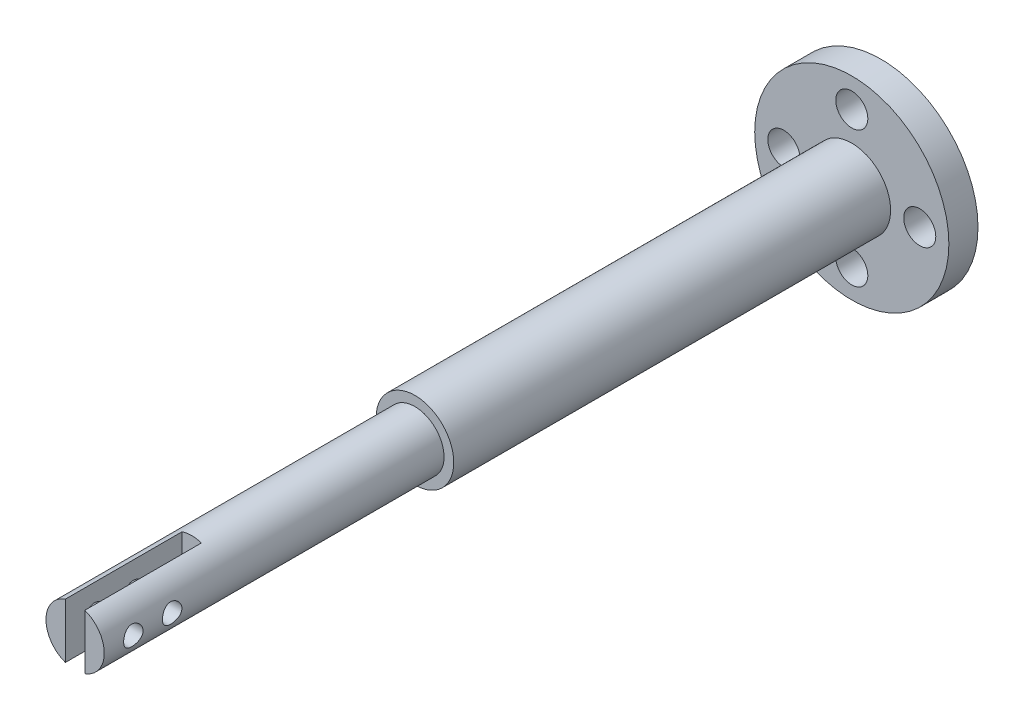
ISO-10303-21;
HEADER;
FILE_DESCRIPTION(('STEP AP214'),'2;1');
FILE_NAME('part.step','',(''),(''),'','','');
FILE_SCHEMA(('AUTOMOTIVE_DESIGN { 1 0 10303 214 1 1 1 1 }'));
ENDSEC;
DATA;
#1=APPLICATION_CONTEXT('core data for automotive mechanical design processes');
#2=APPLICATION_PROTOCOL_DEFINITION('international standard','automotive_design',2000,#1);
#3=PRODUCT_CONTEXT('',#1,'mechanical');
#4=PRODUCT('Part','Part','',(#3));
#5=PRODUCT_RELATED_PRODUCT_CATEGORY('part','',(#4));
#6=PRODUCT_DEFINITION_FORMATION('','',#4);
#7=PRODUCT_DEFINITION_CONTEXT('part definition',#1,'design');
#8=PRODUCT_DEFINITION('design','',#6,#7);
#9=PRODUCT_DEFINITION_SHAPE('','',#8);
#10=(LENGTH_UNIT() NAMED_UNIT(*) SI_UNIT(.MILLI.,.METRE.));
#11=(NAMED_UNIT(*) PLANE_ANGLE_UNIT() SI_UNIT($,.RADIAN.));
#12=(NAMED_UNIT(*) SI_UNIT($,.STERADIAN.) SOLID_ANGLE_UNIT());
#13=UNCERTAINTY_MEASURE_WITH_UNIT(LENGTH_MEASURE(1.E-05),#10,'distance_accuracy_value','');
#14=(GEOMETRIC_REPRESENTATION_CONTEXT(3) GLOBAL_UNCERTAINTY_ASSIGNED_CONTEXT((#13)) GLOBAL_UNIT_ASSIGNED_CONTEXT((#10,
#11,#12)) REPRESENTATION_CONTEXT('',''));
#15=CARTESIAN_POINT('',(0.,0.,0.));
#16=DIRECTION('',(0.,0.,1.));
#17=DIRECTION('',(1.,0.,0.));
#18=AXIS2_PLACEMENT_3D('',#15,#16,#17);
#19=CARTESIAN_POINT('',(0.,0.,3.));
#20=DIRECTION('',(0.,0.,1.));
#21=DIRECTION('',(1.,0.,0.));
#22=AXIS2_PLACEMENT_3D('',#19,#20,#21);
#23=PLANE('',#22);
#24=CARTESIAN_POINT('',(0.,0.,3.));
#25=DIRECTION('',(0.,0.,1.));
#26=DIRECTION('',(1.,0.,0.));
#27=AXIS2_PLACEMENT_3D('',#24,#25,#26);
#28=CIRCLE('',#27,4.);
#29=CARTESIAN_POINT('',(-4.,0.,3.));
#30=VERTEX_POINT('',#29);
#31=EDGE_CURVE('E267',#30,#30,#28,.T.);
#32=ORIENTED_EDGE('',*,*,#31,.F.);
#33=EDGE_LOOP('',(#32));
#34=FACE_BOUND('',#33,.T.);
#35=CARTESIAN_POINT('',(0.,-7.,3.));
#36=DIRECTION('',(0.,0.,1.));
#37=DIRECTION('',(1.,0.,0.));
#38=AXIS2_PLACEMENT_3D('',#35,#36,#37);
#39=CIRCLE('',#38,1.65);
#40=CARTESIAN_POINT('',(1.65,-7.,3.));
#41=VERTEX_POINT('',#40);
#42=EDGE_CURVE('E121',#41,#41,#39,.T.);
#43=ORIENTED_EDGE('',*,*,#42,.F.);
#44=EDGE_LOOP('',(#43));
#45=FACE_BOUND('',#44,.T.);
#46=CARTESIAN_POINT('',(0.,7.,3.));
#47=DIRECTION('',(0.,0.,1.));
#48=DIRECTION('',(1.,0.,0.));
#49=AXIS2_PLACEMENT_3D('',#46,#47,#48);
#50=CIRCLE('',#49,1.65);
#51=CARTESIAN_POINT('',(1.65,7.,3.));
#52=VERTEX_POINT('',#51);
#53=EDGE_CURVE('E137',#52,#52,#50,.T.);
#54=ORIENTED_EDGE('',*,*,#53,.F.);
#55=EDGE_LOOP('',(#54));
#56=FACE_BOUND('',#55,.T.);
#57=CARTESIAN_POINT('',(0.,0.,3.));
#58=DIRECTION('',(0.,0.,1.));
#59=DIRECTION('',(1.,0.,0.));
#60=AXIS2_PLACEMENT_3D('',#57,#58,#59);
#61=CIRCLE('',#60,10.);
#62=CARTESIAN_POINT('',(10.,0.,3.));
#63=VERTEX_POINT('',#62);
#64=EDGE_CURVE('E92',#63,#63,#61,.T.);
#65=ORIENTED_EDGE('',*,*,#64,.T.);
#66=EDGE_LOOP('',(#65));
#67=FACE_BOUND('',#66,.T.);
#68=CARTESIAN_POINT('',(7.,0.,3.));
#69=DIRECTION('',(0.,0.,1.));
#70=DIRECTION('',(1.,0.,0.));
#71=AXIS2_PLACEMENT_3D('',#68,#69,#70);
#72=CIRCLE('',#71,1.65);
#73=CARTESIAN_POINT('',(8.65,0.,3.));
#74=VERTEX_POINT('',#73);
#75=EDGE_CURVE('E129',#74,#74,#72,.T.);
#76=ORIENTED_EDGE('',*,*,#75,.F.);
#77=EDGE_LOOP('',(#76));
#78=FACE_BOUND('',#77,.T.);
#79=CARTESIAN_POINT('',(-7.,0.,3.));
#80=DIRECTION('',(0.,0.,1.));
#81=DIRECTION('',(1.,0.,0.));
#82=AXIS2_PLACEMENT_3D('',#79,#80,#81);
#83=CIRCLE('',#82,1.65);
#84=CARTESIAN_POINT('',(-5.35,0.,3.));
#85=VERTEX_POINT('',#84);
#86=EDGE_CURVE('E110',#85,#85,#83,.T.);
#87=ORIENTED_EDGE('',*,*,#86,.F.);
#88=EDGE_LOOP('',(#87));
#89=FACE_BOUND('',#88,.T.);
#90=ADVANCED_FACE('F39',(#34,#45,#56,#67,#78,#89),#23,.T.);
#91=CARTESIAN_POINT('',(0.,0.,0.));
#92=DIRECTION('',(0.,0.,1.));
#93=DIRECTION('',(1.,0.,0.));
#94=AXIS2_PLACEMENT_3D('',#91,#92,#93);
#95=PLANE('',#94);
#96=CARTESIAN_POINT('',(0.,0.,0.));
#97=DIRECTION('',(0.,0.,1.));
#98=DIRECTION('',(1.,0.,0.));
#99=AXIS2_PLACEMENT_3D('',#96,#97,#98);
#100=CIRCLE('',#99,10.);
#101=CARTESIAN_POINT('',(10.,0.,0.));
#102=VERTEX_POINT('',#101);
#103=EDGE_CURVE('E141',#102,#102,#100,.T.);
#104=ORIENTED_EDGE('',*,*,#103,.F.);
#105=EDGE_LOOP('',(#104));
#106=FACE_BOUND('',#105,.T.);
#107=CARTESIAN_POINT('',(0.,7.,0.));
#108=DIRECTION('',(0.,0.,1.));
#109=DIRECTION('',(1.,0.,0.));
#110=AXIS2_PLACEMENT_3D('',#107,#108,#109);
#111=CIRCLE('',#110,1.65);
#112=CARTESIAN_POINT('',(1.65,7.,0.));
#113=VERTEX_POINT('',#112);
#114=EDGE_CURVE('E133',#113,#113,#111,.T.);
#115=ORIENTED_EDGE('',*,*,#114,.T.);
#116=EDGE_LOOP('',(#115));
#117=FACE_BOUND('',#116,.T.);
#118=CARTESIAN_POINT('',(7.,0.,0.));
#119=DIRECTION('',(0.,0.,1.));
#120=DIRECTION('',(1.,0.,0.));
#121=AXIS2_PLACEMENT_3D('',#118,#119,#120);
#122=CIRCLE('',#121,1.65);
#123=CARTESIAN_POINT('',(8.65,0.,0.));
#124=VERTEX_POINT('',#123);
#125=EDGE_CURVE('E125',#124,#124,#122,.T.);
#126=ORIENTED_EDGE('',*,*,#125,.T.);
#127=EDGE_LOOP('',(#126));
#128=FACE_BOUND('',#127,.T.);
#129=CARTESIAN_POINT('',(0.,-7.,0.));
#130=DIRECTION('',(0.,0.,1.));
#131=DIRECTION('',(1.,0.,0.));
#132=AXIS2_PLACEMENT_3D('',#129,#130,#131);
#133=CIRCLE('',#132,1.65);
#134=CARTESIAN_POINT('',(1.65,-7.,0.));
#135=VERTEX_POINT('',#134);
#136=EDGE_CURVE('E119',#135,#135,#133,.T.);
#137=ORIENTED_EDGE('',*,*,#136,.T.);
#138=EDGE_LOOP('',(#137));
#139=FACE_BOUND('',#138,.T.);
#140=CARTESIAN_POINT('',(-7.,0.,0.));
#141=DIRECTION('',(0.,0.,1.));
#142=DIRECTION('',(1.,0.,0.));
#143=AXIS2_PLACEMENT_3D('',#140,#141,#142);
#144=CIRCLE('',#143,1.65);
#145=CARTESIAN_POINT('',(-5.35,0.,0.));
#146=VERTEX_POINT('',#145);
#147=EDGE_CURVE('E104',#146,#146,#144,.T.);
#148=ORIENTED_EDGE('',*,*,#147,.T.);
#149=EDGE_LOOP('',(#148));
#150=FACE_BOUND('',#149,.T.);
#151=ADVANCED_FACE('F225',(#106,#117,#128,#139,#150),#95,.F.);
#152=CARTESIAN_POINT('',(0.,0.,3.));
#153=DIRECTION('',(0.,0.,-1.));
#154=DIRECTION('',(-1.,0.,0.));
#155=AXIS2_PLACEMENT_3D('',#152,#153,#154);
#156=CYLINDRICAL_SURFACE('',#155,10.);
#157=ORIENTED_EDGE('',*,*,#64,.F.);
#158=EDGE_LOOP('',(#157));
#159=FACE_BOUND('',#158,.T.);
#160=ORIENTED_EDGE('',*,*,#103,.T.);
#161=EDGE_LOOP('',(#160));
#162=FACE_BOUND('',#161,.T.);
#163=ADVANCED_FACE('F41',(#159,#162),#156,.T.);
#164=CARTESIAN_POINT('',(0.,7.,3.));
#165=DIRECTION('',(0.,0.,-1.));
#166=DIRECTION('',(-1.,0.,0.));
#167=AXIS2_PLACEMENT_3D('',#164,#165,#166);
#168=CYLINDRICAL_SURFACE('',#167,1.65);
#169=ORIENTED_EDGE('',*,*,#53,.T.);
#170=EDGE_LOOP('',(#169));
#171=FACE_BOUND('',#170,.T.);
#172=ORIENTED_EDGE('',*,*,#114,.F.);
#173=EDGE_LOOP('',(#172));
#174=FACE_BOUND('',#173,.T.);
#175=ADVANCED_FACE('F237',(#171,#174),#168,.F.);
#176=CARTESIAN_POINT('',(7.,0.,3.));
#177=DIRECTION('',(0.,0.,-1.));
#178=DIRECTION('',(-1.,0.,0.));
#179=AXIS2_PLACEMENT_3D('',#176,#177,#178);
#180=CYLINDRICAL_SURFACE('',#179,1.65);
#181=ORIENTED_EDGE('',*,*,#75,.T.);
#182=EDGE_LOOP('',(#181));
#183=FACE_BOUND('',#182,.T.);
#184=ORIENTED_EDGE('',*,*,#125,.F.);
#185=EDGE_LOOP('',(#184));
#186=FACE_BOUND('',#185,.T.);
#187=ADVANCED_FACE('F240',(#183,#186),#180,.F.);
#188=CARTESIAN_POINT('',(0.,-7.,3.));
#189=DIRECTION('',(0.,0.,-1.));
#190=DIRECTION('',(-1.,0.,0.));
#191=AXIS2_PLACEMENT_3D('',#188,#189,#190);
#192=CYLINDRICAL_SURFACE('',#191,1.65);
#193=ORIENTED_EDGE('',*,*,#42,.T.);
#194=EDGE_LOOP('',(#193));
#195=FACE_BOUND('',#194,.T.);
#196=ORIENTED_EDGE('',*,*,#136,.F.);
#197=EDGE_LOOP('',(#196));
#198=FACE_BOUND('',#197,.T.);
#199=ADVANCED_FACE('F244',(#195,#198),#192,.F.);
#200=CARTESIAN_POINT('',(-7.,0.,3.));
#201=DIRECTION('',(0.,0.,-1.));
#202=DIRECTION('',(-1.,0.,0.));
#203=AXIS2_PLACEMENT_3D('',#200,#201,#202);
#204=CYLINDRICAL_SURFACE('',#203,1.65);
#205=ORIENTED_EDGE('',*,*,#86,.T.);
#206=EDGE_LOOP('',(#205));
#207=FACE_BOUND('',#206,.T.);
#208=ORIENTED_EDGE('',*,*,#147,.F.);
#209=EDGE_LOOP('',(#208));
#210=FACE_BOUND('',#209,.T.);
#211=ADVANCED_FACE('F247',(#207,#210),#204,.F.);
#212=CARTESIAN_POINT('',(0.,0.,48.));
#213=DIRECTION('',(0.,0.,-1.));
#214=DIRECTION('',(-1.,0.,0.));
#215=AXIS2_PLACEMENT_3D('',#212,#213,#214);
#216=CYLINDRICAL_SURFACE('',#215,4.);
#217=CARTESIAN_POINT('',(0.,0.,48.));
#218=DIRECTION('',(0.,0.,1.));
#219=DIRECTION('',(1.,0.,0.));
#220=AXIS2_PLACEMENT_3D('',#217,#218,#219);
#221=CIRCLE('',#220,4.);
#222=CARTESIAN_POINT('',(-4.,0.,48.));
#223=VERTEX_POINT('',#222);
#224=EDGE_CURVE('E265',#223,#223,#221,.T.);
#225=CARTESIAN_POINT('',(-4.,0.,48.));
#226=CARTESIAN_POINT('',(-4.,0.,47.53125));
#227=CARTESIAN_POINT('',(-4.,0.,47.0625));
#228=CARTESIAN_POINT('',(-4.,0.,46.125));
#229=CARTESIAN_POINT('',(-4.,0.,45.65625));
#230=CARTESIAN_POINT('',(-4.,0.,44.71875));
#231=CARTESIAN_POINT('',(-4.,0.,44.25));
#232=CARTESIAN_POINT('',(-4.,0.,43.3125));
#233=CARTESIAN_POINT('',(-4.,0.,42.84375));
#234=CARTESIAN_POINT('',(-4.,0.,41.90625));
#235=CARTESIAN_POINT('',(-4.,0.,41.4375));
#236=CARTESIAN_POINT('',(-4.,0.,40.5));
#237=CARTESIAN_POINT('',(-4.,0.,40.03125));
#238=CARTESIAN_POINT('',(-4.,0.,39.09375));
#239=CARTESIAN_POINT('',(-4.,0.,38.625));
#240=CARTESIAN_POINT('',(-4.,0.,37.6875));
#241=CARTESIAN_POINT('',(-4.,0.,37.21875));
#242=CARTESIAN_POINT('',(-4.,0.,36.28125));
#243=CARTESIAN_POINT('',(-4.,0.,35.8125));
#244=CARTESIAN_POINT('',(-4.,0.,34.875));
#245=CARTESIAN_POINT('',(-4.,0.,34.40625));
#246=CARTESIAN_POINT('',(-4.,0.,33.46875));
#247=CARTESIAN_POINT('',(-4.,0.,33.));
#248=CARTESIAN_POINT('',(-4.,0.,32.0625));
#249=CARTESIAN_POINT('',(-4.,0.,31.59375));
#250=CARTESIAN_POINT('',(-4.,0.,30.65625));
#251=CARTESIAN_POINT('',(-4.,0.,30.1875));
#252=CARTESIAN_POINT('',(-4.,0.,29.25));
#253=CARTESIAN_POINT('',(-4.,0.,28.78125));
#254=CARTESIAN_POINT('',(-4.,0.,27.84375));
#255=CARTESIAN_POINT('',(-4.,0.,27.375));
#256=CARTESIAN_POINT('',(-4.,0.,26.4375));
#257=CARTESIAN_POINT('',(-4.,0.,25.96875));
#258=CARTESIAN_POINT('',(-4.,0.,25.03125));
#259=CARTESIAN_POINT('',(-4.,0.,24.5625));
#260=CARTESIAN_POINT('',(-4.,0.,23.625));
#261=CARTESIAN_POINT('',(-4.,0.,23.15625));
#262=CARTESIAN_POINT('',(-4.,0.,22.21875));
#263=CARTESIAN_POINT('',(-4.,0.,21.75));
#264=CARTESIAN_POINT('',(-4.,0.,20.8125));
#265=CARTESIAN_POINT('',(-4.,0.,20.34375));
#266=CARTESIAN_POINT('',(-4.,0.,19.40625));
#267=CARTESIAN_POINT('',(-4.,0.,18.9375));
#268=CARTESIAN_POINT('',(-4.,0.,18.));
#269=CARTESIAN_POINT('',(-4.,0.,17.53125));
#270=CARTESIAN_POINT('',(-4.,0.,16.59375));
#271=CARTESIAN_POINT('',(-4.,0.,16.125));
#272=CARTESIAN_POINT('',(-4.,0.,15.1875));
#273=CARTESIAN_POINT('',(-4.,0.,14.71875));
#274=CARTESIAN_POINT('',(-4.,0.,13.78125));
#275=CARTESIAN_POINT('',(-4.,0.,13.3125));
#276=CARTESIAN_POINT('',(-4.,0.,12.375));
#277=CARTESIAN_POINT('',(-4.,0.,11.90625));
#278=CARTESIAN_POINT('',(-4.,0.,10.96875));
#279=CARTESIAN_POINT('',(-4.,0.,10.5));
#280=CARTESIAN_POINT('',(-4.,0.,9.5625));
#281=CARTESIAN_POINT('',(-4.,0.,9.09375));
#282=CARTESIAN_POINT('',(-4.,0.,8.15624999999999));
#283=CARTESIAN_POINT('',(-4.,0.,7.6875));
#284=CARTESIAN_POINT('',(-4.,0.,6.75));
#285=CARTESIAN_POINT('',(-4.,0.,6.28125));
#286=CARTESIAN_POINT('',(-4.,0.,5.34375));
#287=CARTESIAN_POINT('',(-4.,0.,4.87499999999999));
#288=CARTESIAN_POINT('',(-4.,0.,3.93749999999999));
#289=CARTESIAN_POINT('',(-4.,0.,3.46875));
#290=CARTESIAN_POINT('',(-4.,0.,3.));
#291=B_SPLINE_CURVE_WITH_KNOTS('',3,(#225,#226,#227,#228,#229,#230,#231,#232,#233,#234,#235,
#236,#237,#238,#239,#240,#241,#242,#243,#244,#245,#246,#247,#248,#249,#250,#251,#252,#253,#254,
#255,#256,#257,#258,#259,#260,#261,#262,#263,#264,#265,#266,#267,#268,#269,#270,#271,#272,#273,
#274,#275,#276,#277,#278,#279,#280,#281,#282,#283,#284,#285,#286,#287,#288,#289,#290),
.UNSPECIFIED.,.F.,.F.,(4,2,2,2,2,2,2,2,2,2,2,2,2,2,2,2,2,2,2,2,2,2,2,2,2,2,2,2,2,2,2,2,4),(0.,
1.40625,2.8125,4.21874999999999,5.625,7.03125,8.43749999999999,9.84375,11.25,12.65625,14.0625,
15.46875,16.875,18.28125,19.6875,21.09375,22.5,23.90625,25.3125,26.71875,28.125,29.53125,
30.9375,32.34375,33.75,35.15625,36.5625,37.96875,39.375,40.78125,42.1875,43.59375,45.),.UNSPECIFIED.);
#292=EDGE_CURVE('BSEAM219',#223,#30,#291,.T.);
#293=ORIENTED_EDGE('',*,*,#224,.F.);
#294=ORIENTED_EDGE('',*,*,#31,.T.);
#295=ORIENTED_EDGE('',*,*,#292,.T.);
#296=ORIENTED_EDGE('',*,*,#292,.F.);
#297=EDGE_LOOP('',(#293,#295,#294,#296));
#298=FACE_BOUND('',#297,.T.);
#299=ADVANCED_FACE('F219',(#298),#216,.T.);
#300=CARTESIAN_POINT('',(0.,0.,48.));
#301=DIRECTION('',(0.,0.,1.));
#302=DIRECTION('',(1.,0.,0.));
#303=AXIS2_PLACEMENT_3D('',#300,#301,#302);
#304=PLANE('',#303);
#305=CARTESIAN_POINT('',(0.,0.,48.));
#306=DIRECTION('',(0.,0.,1.));
#307=DIRECTION('',(1.,0.,0.));
#308=AXIS2_PLACEMENT_3D('',#305,#306,#307);
#309=CIRCLE('',#308,3.);
#310=CARTESIAN_POINT('',(3.,0.,48.));
#311=VERTEX_POINT('',#310);
#312=EDGE_CURVE('E43',#311,#311,#309,.T.);
#313=ORIENTED_EDGE('',*,*,#312,.F.);
#314=EDGE_LOOP('',(#313));
#315=FACE_BOUND('',#314,.T.);
#316=ORIENTED_EDGE('',*,*,#224,.T.);
#317=EDGE_LOOP('',(#316));
#318=FACE_BOUND('',#317,.T.);
#319=ADVANCED_FACE('F214',(#315,#318),#304,.T.);
#320=CARTESIAN_POINT('',(0.,0.,83.));
#321=DIRECTION('',(0.,0.,1.));
#322=DIRECTION('',(1.,0.,0.));
#323=AXIS2_PLACEMENT_3D('',#320,#321,#322);
#324=PLANE('',#323);
#325=DIRECTION('',(0.,-1.,0.));
#326=VECTOR('',#325,1.);
#327=CARTESIAN_POINT('',(-1.,0.,83.));
#328=LINE('',#327,#326);
#329=CARTESIAN_POINT('',(-1.,2.82842712474619,83.));
#330=VERTEX_POINT('',#329);
#331=CARTESIAN_POINT('',(-1.,-2.82842712474619,83.));
#332=VERTEX_POINT('',#331);
#333=EDGE_CURVE('E82',#330,#332,#328,.T.);
#334=ORIENTED_EDGE('',*,*,#333,.F.);
#335=CARTESIAN_POINT('',(0.,0.,83.));
#336=DIRECTION('',(0.,0.,1.));
#337=DIRECTION('',(1.,0.,0.));
#338=AXIS2_PLACEMENT_3D('',#335,#336,#337);
#339=CIRCLE('',#338,3.);
#340=EDGE_CURVE('E97',#330,#332,#339,.T.);
#341=ORIENTED_EDGE('',*,*,#340,.T.);
#342=EDGE_LOOP('',(#334,#341));
#343=FACE_BOUND('',#342,.T.);
#344=ADVANCED_FACE('F102',(#343),#324,.T.);
#345=CARTESIAN_POINT('',(-1.,-3.87167745645733,71.));
#346=DIRECTION('',(-1.,0.,0.));
#347=DIRECTION('',(0.,0.,1.));
#348=AXIS2_PLACEMENT_3D('',#345,#346,#347);
#349=PLANE('',#348);
#350=CARTESIAN_POINT('',(-1.,0.,80.));
#351=DIRECTION('',(-1.,0.,0.));
#352=DIRECTION('',(0.,0.,1.));
#353=AXIS2_PLACEMENT_3D('',#350,#351,#352);
#354=CIRCLE('',#353,0.999999999999998);
#355=CARTESIAN_POINT('',(-1.,0.,81.));
#356=VERTEX_POINT('',#355);
#357=EDGE_CURVE('E158',#356,#356,#354,.T.);
#358=ORIENTED_EDGE('',*,*,#357,.T.);
#359=EDGE_LOOP('',(#358));
#360=FACE_BOUND('',#359,.T.);
#361=CARTESIAN_POINT('',(-1.,0.,76.));
#362=DIRECTION('',(-1.,0.,0.));
#363=DIRECTION('',(0.,0.,1.));
#364=AXIS2_PLACEMENT_3D('',#361,#362,#363);
#365=CIRCLE('',#364,0.999999999999998);
#366=CARTESIAN_POINT('',(-1.,0.,77.));
#367=VERTEX_POINT('',#366);
#368=EDGE_CURVE('E154',#367,#367,#365,.T.);
#369=ORIENTED_EDGE('',*,*,#368,.T.);
#370=EDGE_LOOP('',(#369));
#371=FACE_BOUND('',#370,.T.);
#372=ORIENTED_EDGE('',*,*,#333,.T.);
#373=DIRECTION('',(0.,0.,-1.));
#374=VECTOR('',#373,1.);
#375=CARTESIAN_POINT('',(-1.,-2.82842712474619,83.));
#376=LINE('',#375,#374);
#377=CARTESIAN_POINT('',(-1.,-2.82842712474619,71.));
#378=VERTEX_POINT('',#377);
#379=EDGE_CURVE('E85',#378,#332,#376,.F.);
#380=ORIENTED_EDGE('',*,*,#379,.F.);
#381=DIRECTION('',(0.,-1.,0.));
#382=VECTOR('',#381,1.);
#383=CARTESIAN_POINT('',(-1.,-3.87167745645733,71.));
#384=LINE('',#383,#382);
#385=CARTESIAN_POINT('',(-1.,2.82842712474619,71.));
#386=VERTEX_POINT('',#385);
#387=EDGE_CURVE('E100',#386,#378,#384,.T.);
#388=ORIENTED_EDGE('',*,*,#387,.F.);
#389=DIRECTION('',(0.,0.,-1.));
#390=VECTOR('',#389,1.);
#391=CARTESIAN_POINT('',(-1.,2.82842712474619,83.));
#392=LINE('',#391,#390);
#393=EDGE_CURVE('E57',#330,#386,#392,.T.);
#394=ORIENTED_EDGE('',*,*,#393,.F.);
#395=EDGE_LOOP('',(#372,#380,#388,#394));
#396=FACE_BOUND('',#395,.T.);
#397=ADVANCED_FACE('F84',(#360,#371,#396),#349,.F.);
#398=DIRECTION('',(0.,1.,0.));
#399=VECTOR('',#398,1.);
#400=CARTESIAN_POINT('',(1.,0.,83.));
#401=LINE('',#400,#399);
#402=CARTESIAN_POINT('',(1.,-2.82842712474619,83.));
#403=VERTEX_POINT('',#402);
#404=CARTESIAN_POINT('',(1.,2.82842712474619,83.));
#405=VERTEX_POINT('',#404);
#406=EDGE_CURVE('E91',#403,#405,#401,.T.);
#407=ORIENTED_EDGE('',*,*,#406,.F.);
#408=EDGE_CURVE('E105',#403,#405,#339,.T.);
#409=ORIENTED_EDGE('',*,*,#408,.T.);
#410=EDGE_LOOP('',(#407,#409));
#411=FACE_BOUND('',#410,.T.);
#412=ADVANCED_FACE('F210',(#411),#324,.T.);
#413=CARTESIAN_POINT('',(1.,-3.87167745645733,71.));
#414=DIRECTION('',(1.,0.,0.));
#415=DIRECTION('',(0.,0.,-1.));
#416=AXIS2_PLACEMENT_3D('',#413,#414,#415);
#417=PLANE('',#416);
#418=CARTESIAN_POINT('',(1.,0.,80.));
#419=DIRECTION('',(1.,0.,0.));
#420=DIRECTION('',(0.,0.,-1.));
#421=AXIS2_PLACEMENT_3D('',#418,#419,#420);
#422=CIRCLE('',#421,0.999999999999998);
#423=CARTESIAN_POINT('',(1.,0.,79.));
#424=VERTEX_POINT('',#423);
#425=EDGE_CURVE('E161',#424,#424,#422,.T.);
#426=ORIENTED_EDGE('',*,*,#425,.T.);
#427=EDGE_LOOP('',(#426));
#428=FACE_BOUND('',#427,.T.);
#429=CARTESIAN_POINT('',(1.,0.,76.));
#430=DIRECTION('',(1.,0.,0.));
#431=DIRECTION('',(0.,0.,-1.));
#432=AXIS2_PLACEMENT_3D('',#429,#430,#431);
#433=CIRCLE('',#432,0.999999999999998);
#434=CARTESIAN_POINT('',(1.,0.,75.));
#435=VERTEX_POINT('',#434);
#436=EDGE_CURVE('E157',#435,#435,#433,.T.);
#437=ORIENTED_EDGE('',*,*,#436,.T.);
#438=EDGE_LOOP('',(#437));
#439=FACE_BOUND('',#438,.T.);
#440=ORIENTED_EDGE('',*,*,#406,.T.);
#441=DIRECTION('',(0.,0.,-1.));
#442=VECTOR('',#441,1.);
#443=CARTESIAN_POINT('',(1.,2.82842712474619,83.));
#444=LINE('',#443,#442);
#445=CARTESIAN_POINT('',(1.,2.82842712474619,71.));
#446=VERTEX_POINT('',#445);
#447=EDGE_CURVE('E65',#446,#405,#444,.F.);
#448=ORIENTED_EDGE('',*,*,#447,.F.);
#449=DIRECTION('',(0.,1.,0.));
#450=VECTOR('',#449,1.);
#451=CARTESIAN_POINT('',(1.,-3.87167745645733,71.));
#452=LINE('',#451,#450);
#453=CARTESIAN_POINT('',(1.,-2.82842712474619,71.));
#454=VERTEX_POINT('',#453);
#455=EDGE_CURVE('E299',#454,#446,#452,.T.);
#456=ORIENTED_EDGE('',*,*,#455,.F.);
#457=DIRECTION('',(0.,0.,-1.));
#458=VECTOR('',#457,1.);
#459=CARTESIAN_POINT('',(1.,-2.82842712474619,83.));
#460=LINE('',#459,#458);
#461=EDGE_CURVE('E113',#403,#454,#460,.T.);
#462=ORIENTED_EDGE('',*,*,#461,.F.);
#463=EDGE_LOOP('',(#440,#448,#456,#462));
#464=FACE_BOUND('',#463,.T.);
#465=ADVANCED_FACE('F206',(#428,#439,#464),#417,.F.);
#466=CARTESIAN_POINT('',(0.,0.,71.));
#467=DIRECTION('',(0.,0.,-1.));
#468=DIRECTION('',(-1.,0.,0.));
#469=AXIS2_PLACEMENT_3D('',#466,#467,#468);
#470=PLANE('',#469);
#471=ORIENTED_EDGE('',*,*,#387,.T.);
#472=CARTESIAN_POINT('',(0.,0.,71.));
#473=DIRECTION('',(0.,0.,-1.));
#474=DIRECTION('',(-1.,0.,0.));
#475=AXIS2_PLACEMENT_3D('',#472,#473,#474);
#476=CIRCLE('',#475,3.);
#477=EDGE_CURVE('E49',#454,#378,#476,.T.);
#478=ORIENTED_EDGE('',*,*,#477,.F.);
#479=ORIENTED_EDGE('',*,*,#455,.T.);
#480=EDGE_CURVE('E11',#386,#446,#476,.T.);
#481=ORIENTED_EDGE('',*,*,#480,.F.);
#482=EDGE_LOOP('',(#471,#478,#479,#481));
#483=FACE_BOUND('',#482,.T.);
#484=ADVANCED_FACE('F202',(#483),#470,.F.);
#485=CARTESIAN_POINT('',(-6.,0.,76.));
#486=DIRECTION('',(1.,0.,0.));
#487=DIRECTION('',(0.,0.,-1.));
#488=AXIS2_PLACEMENT_3D('',#485,#486,#487);
#489=CYLINDRICAL_SURFACE('',#488,0.999999999999998);
#490=ORIENTED_EDGE('',*,*,#436,.F.);
#491=EDGE_LOOP('',(#490));
#492=FACE_BOUND('',#491,.T.);
#493=CARTESIAN_POINT('',(3.,0.,75.));
#494=CARTESIAN_POINT('',(3.00000015300943,-0.0545633628867229,74.9999997462684));
#495=CARTESIAN_POINT('',(2.99849769507545,-0.109125194538549,75.0044802661272));
#496=CARTESIAN_POINT('',(2.99265210203281,-0.21664176087297,75.0222291088172));
#497=CARTESIAN_POINT('',(2.98830867202153,-0.269596328118816,75.0354983439489));
#498=CARTESIAN_POINT('',(2.97725307906443,-0.372332789501776,75.070319243384));
#499=CARTESIAN_POINT('',(2.97054487730853,-0.422119825886035,75.0918570624593));
#500=CARTESIAN_POINT('',(2.95544445717342,-0.517374936805327,75.1425411728383));
#501=CARTESIAN_POINT('',(2.94705190667778,-0.562842156958707,75.1716889650026));
#502=CARTESIAN_POINT('',(2.92914094443005,-0.649741675022266,75.2378258048587));
#503=CARTESIAN_POINT('',(2.91959556463785,-0.691003700298307,75.2750312342605));
#504=CARTESIAN_POINT('',(2.90060314783122,-0.766832692702081,75.3557671547066));
#505=CARTESIAN_POINT('',(2.89115613290549,-0.80139818548946,75.3992990349285));
#506=CARTESIAN_POINT('',(2.87313332477274,-0.863824942227858,75.4929851151964));
#507=CARTESIAN_POINT('',(2.86459039275688,-0.891464858221031,75.5432937397321));
#508=CARTESIAN_POINT('',(2.84975305418601,-0.93781887387772,75.6481760944585));
#509=CARTESIAN_POINT('',(2.84345796160746,-0.956535697386762,75.7027485171627));
#510=CARTESIAN_POINT('',(2.83411303269377,-0.983873461509162,75.8126732214967));
#511=CARTESIAN_POINT('',(2.83096095769611,-0.992813448271768,75.8679372084891));
#512=CARTESIAN_POINT('',(2.82795656629508,-1.00134112333448,75.9792637541559));
#513=CARTESIAN_POINT('',(2.8281032302273,-1.00093170160472,76.0353260607092));
#514=CARTESIAN_POINT('',(2.8315901500818,-0.991019903703416,76.143936630444));
#515=CARTESIAN_POINT('',(2.83478415867533,-0.981933913166992,76.196528402919));
#516=CARTESIAN_POINT('',(2.84376657724551,-0.955606162849415,76.2993934196068));
#517=CARTESIAN_POINT('',(2.84955529784108,-0.93836342659187,76.3496663854351));
#518=CARTESIAN_POINT('',(2.86317911131249,-0.895939058060209,76.4474127495915));
#519=CARTESIAN_POINT('',(2.87104565793118,-0.870634048707256,76.4948280254695));
#520=CARTESIAN_POINT('',(2.88792558575727,-0.812889106303132,76.5848709082797));
#521=CARTESIAN_POINT('',(2.89693929790464,-0.780447112364002,76.6274971269334));
#522=CARTESIAN_POINT('',(2.91567329167741,-0.707349332682236,76.7090915981608));
#523=CARTESIAN_POINT('',(2.92540589354843,-0.666353150076308,76.7477526945091));
#524=CARTESIAN_POINT('',(2.94406938387037,-0.578339569970058,76.8177312666634));
#525=CARTESIAN_POINT('',(2.95300019538068,-0.531321595660809,76.8490480381645));
#526=CARTESIAN_POINT('',(2.96917107937794,-0.431947613046264,76.9036963002351));
#527=CARTESIAN_POINT('',(2.9763935000804,-0.379543276416334,76.9269454913407));
#528=CARTESIAN_POINT('',(2.98820567144435,-0.271269083364507,76.9642031739557));
#529=CARTESIAN_POINT('',(2.99279633654878,-0.215400438154954,76.9782148754234));
#530=CARTESIAN_POINT('',(2.99867627071441,-0.104383829529306,76.9960556660223));
#531=CARTESIAN_POINT('',(3.00010001833731,-0.0493095998648474,77.0002998091727));
#532=CARTESIAN_POINT('',(2.99988902694825,0.0607750699602345,76.9996673264015));
#533=CARTESIAN_POINT('',(2.99825480419352,0.115785519319646,76.9947922400201));
#534=CARTESIAN_POINT('',(2.99220024717114,0.222519866304258,76.976388092264));
#535=CARTESIAN_POINT('',(2.98786198711228,0.274292806834856,76.9631137939505));
#536=CARTESIAN_POINT('',(2.97691846830034,0.37485595857956,76.9286065555333));
#537=CARTESIAN_POINT('',(2.97031292046541,0.423645788508557,76.9073726005323));
#538=CARTESIAN_POINT('',(2.95528931287427,0.518288296393322,76.8569295681591));
#539=CARTESIAN_POINT('',(2.94682814756305,0.564029959217335,76.8275254067164));
#540=CARTESIAN_POINT('',(2.92905253915743,0.65006483013541,76.7618058499869));
#541=CARTESIAN_POINT('',(2.91973783591888,0.690356367794896,76.7254883439698));
#542=CARTESIAN_POINT('',(2.90076847982472,0.766252507807014,76.6450212489917));
#543=CARTESIAN_POINT('',(2.89111761095155,0.801560969248494,76.6005907730667));
#544=CARTESIAN_POINT('',(2.87299973286981,0.864257522320855,76.5062284321955));
#545=CARTESIAN_POINT('',(2.8645327335312,0.891645547920842,76.4562965213898));
#546=CARTESIAN_POINT('',(2.84982391820308,0.937596930423356,76.3523269846934));
#547=CARTESIAN_POINT('',(2.84357760900632,0.95617813219776,76.2982979207572));
#548=CARTESIAN_POINT('',(2.83410832399134,0.983894666792159,76.1876213498759));
#549=CARTESIAN_POINT('',(2.83088398622699,0.993034254961241,76.1309750345669));
#550=CARTESIAN_POINT('',(2.82797858875071,1.00127628247038,76.0198029039868));
#551=CARTESIAN_POINT('',(2.82812400344299,1.00087025731093,75.9653176597483));
#552=CARTESIAN_POINT('',(2.8315126992356,0.991242293454876,75.8572349251003));
#553=CARTESIAN_POINT('',(2.83475579595884,0.982020879458884,75.8036373820471));
#554=CARTESIAN_POINT('',(2.84384524278944,0.955371813126978,75.6998643369873));
#555=CARTESIAN_POINT('',(2.84964098015514,0.938103346014875,75.6496431749928));
#556=CARTESIAN_POINT('',(2.86316398825434,0.895979365760374,75.5527725930644));
#557=CARTESIAN_POINT('',(2.87089168765297,0.871122168553971,75.5061239688127));
#558=CARTESIAN_POINT('',(2.8878282922406,0.81326069258324,75.4155163300763));
#559=CARTESIAN_POINT('',(2.89708711641604,0.779948242764523,75.3717634981014));
#560=CARTESIAN_POINT('',(2.91583356283786,0.706642883135691,75.290310186616));
#561=CARTESIAN_POINT('',(2.92532124912518,0.666648084451492,75.252611424312));
#562=CARTESIAN_POINT('',(2.94390030525393,0.579241556920674,75.1828555877108));
#563=CARTESIAN_POINT('',(2.95296181801216,0.531601513499723,75.151075652249));
#564=CARTESIAN_POINT('',(2.96925991172653,0.431357357406624,75.0960095711494));
#565=CARTESIAN_POINT('',(2.97649695907941,0.378754518132346,75.072721254078));
#566=CARTESIAN_POINT('',(2.98805515068532,0.272493647200972,75.0362783675113));
#567=CARTESIAN_POINT('',(2.9924921242252,0.218987757676405,75.0227175337366));
#568=CARTESIAN_POINT('',(2.99846407064225,0.110320416010245,75.0045797193229));
#569=CARTESIAN_POINT('',(2.99999984531906,0.0551594255687453,75.0000002565035));
#570=CARTESIAN_POINT('',(3.,0.,75.));
#571=B_SPLINE_CURVE_WITH_KNOTS('',3,(#493,#494,#495,#496,#497,#498,#499,#500,#501,#502,#503,
#504,#505,#506,#507,#508,#509,#510,#511,#512,#513,#514,#515,#516,#517,#518,#519,#520,#521,#522,
#523,#524,#525,#526,#527,#528,#529,#530,#531,#532,#533,#534,#535,#536,#537,#538,#539,#540,#541,
#542,#543,#544,#545,#546,#547,#548,#549,#550,#551,#552,#553,#554,#555,#556,#557,#558,#559,#560,
#561,#562,#563,#564,#565,#566,#567,#568,#569,#570),.UNSPECIFIED.,.T.,.F.,(4,2,2,2,2,2,2,2,2,2,2,
2,2,2,2,2,2,2,2,2,2,2,2,2,2,2,2,2,2,2,2,2,2,2,2,2,2,2,4),(0.,0.16348710602601,0.32699118526752,
0.490222672870272,0.653486377799098,0.82184684282756,0.990244332875296,1.1634838482347,
1.33667044692833,1.5040192574184,1.67131633987485,1.83096826551281,1.99063930855482,
2.15288171155131,2.31517102558207,2.48593305811367,2.65671145966618,2.82918405650357,
3.00159668877207,3.16653583175169,3.33144713164176,3.49158157978213,3.65173645284103,
3.81610399843736,3.98052180821891,4.15241022880752,4.32430008234996,4.49584013824414,
4.66730284700845,4.82995666056618,4.99260079341184,5.15215587070228,5.31174638165788,
5.47830066681615,5.64490211113588,5.8179966082491,5.99104681142266,6.15636558363623,
6.32163866027949),.UNSPECIFIED.);
#572=CARTESIAN_POINT('',(3.,0.,75.));
#573=VERTEX_POINT('',#572);
#574=EDGE_CURVE('E171',#573,#573,#571,.T.);
#575=ORIENTED_EDGE('',*,*,#574,.F.);
#576=EDGE_LOOP('',(#575));
#577=FACE_BOUND('',#576,.T.);
#578=ADVANCED_FACE('F197',(#492,#577),#489,.F.);
#579=ORIENTED_EDGE('',*,*,#368,.F.);
#580=EDGE_LOOP('',(#579));
#581=FACE_BOUND('',#580,.T.);
#582=CARTESIAN_POINT('',(-3.,0.,77.));
#583=CARTESIAN_POINT('',(-3.00000015300943,-0.0545633628867229,77.0000002537316));
#584=CARTESIAN_POINT('',(-2.99849769507545,-0.109125194538549,76.9955197338728));
#585=CARTESIAN_POINT('',(-2.99265210203281,-0.21664176087297,76.9777708911828));
#586=CARTESIAN_POINT('',(-2.98830867202153,-0.269596328118816,76.9645016560511));
#587=CARTESIAN_POINT('',(-2.97725307906443,-0.372332789501776,76.929680756616));
#588=CARTESIAN_POINT('',(-2.97054487730853,-0.422119825886035,76.9081429375407));
#589=CARTESIAN_POINT('',(-2.95544445717342,-0.517374936805327,76.8574588271617));
#590=CARTESIAN_POINT('',(-2.94705190667778,-0.562842156958707,76.8283110349974));
#591=CARTESIAN_POINT('',(-2.92914094443005,-0.649741675022266,76.7621741951413));
#592=CARTESIAN_POINT('',(-2.91959556463785,-0.691003700298307,76.7249687657395));
#593=CARTESIAN_POINT('',(-2.90060314783122,-0.76683269270208,76.6442328452934));
#594=CARTESIAN_POINT('',(-2.89115613290549,-0.80139818548946,76.6007009650715));
#595=CARTESIAN_POINT('',(-2.87313332477274,-0.863824942227856,76.5070148848036));
#596=CARTESIAN_POINT('',(-2.86459039275688,-0.891464858221028,76.4567062602679));
#597=CARTESIAN_POINT('',(-2.84975305418601,-0.937818873877718,76.3518239055415));
#598=CARTESIAN_POINT('',(-2.84345796160746,-0.956535697386762,76.2972514828373));
#599=CARTESIAN_POINT('',(-2.83411303269377,-0.98387346150916,76.1873267785033));
#600=CARTESIAN_POINT('',(-2.83096095769611,-0.992813448271767,76.1320627915109));
#601=CARTESIAN_POINT('',(-2.82795656629508,-1.00134112333448,76.0207362458441));
#602=CARTESIAN_POINT('',(-2.8281032302273,-1.00093170160472,75.9646739392908));
#603=CARTESIAN_POINT('',(-2.8315901500818,-0.991019903703416,75.856063369556));
#604=CARTESIAN_POINT('',(-2.83478415867533,-0.981933913166992,75.803471597081));
#605=CARTESIAN_POINT('',(-2.84376657724551,-0.955606162849415,75.7006065803932));
#606=CARTESIAN_POINT('',(-2.84955529784108,-0.93836342659187,75.6503336145649));
#607=CARTESIAN_POINT('',(-2.86317911131249,-0.895939058060209,75.5525872504085));
#608=CARTESIAN_POINT('',(-2.87104565793118,-0.870634048707256,75.5051719745305));
#609=CARTESIAN_POINT('',(-2.88792558575727,-0.812889106303132,75.4151290917203));
#610=CARTESIAN_POINT('',(-2.89693929790464,-0.780447112364002,75.3725028730666));
#611=CARTESIAN_POINT('',(-2.91567329167741,-0.707349332682236,75.2909084018392));
#612=CARTESIAN_POINT('',(-2.92540589354843,-0.666353150076308,75.2522473054909));
#613=CARTESIAN_POINT('',(-2.94406938387037,-0.578339569970058,75.1822687333366));
#614=CARTESIAN_POINT('',(-2.95300019538068,-0.531321595660809,75.1509519618355));
#615=CARTESIAN_POINT('',(-2.96917107937794,-0.431947613046264,75.0963036997649));
#616=CARTESIAN_POINT('',(-2.9763935000804,-0.379543276416334,75.0730545086593));
#617=CARTESIAN_POINT('',(-2.98820567144435,-0.271269083364507,75.0357968260443));
#618=CARTESIAN_POINT('',(-2.99279633654878,-0.215400438154954,75.0217851245766));
#619=CARTESIAN_POINT('',(-2.99867627071441,-0.104383829529306,75.0039443339777));
#620=CARTESIAN_POINT('',(-3.00010001833731,-0.0493095998648474,74.9997001908273));
#621=CARTESIAN_POINT('',(-2.99988902694825,0.0607750699602345,75.0003326735985));
#622=CARTESIAN_POINT('',(-2.99825480419352,0.115785519319646,75.0052077599799));
#623=CARTESIAN_POINT('',(-2.99220024717114,0.222519866304258,75.023611907736));
#624=CARTESIAN_POINT('',(-2.98786198711228,0.274292806834856,75.0368862060495));
#625=CARTESIAN_POINT('',(-2.97691846830034,0.37485595857956,75.0713934444667));
#626=CARTESIAN_POINT('',(-2.97031292046541,0.423645788508557,75.0926273994677));
#627=CARTESIAN_POINT('',(-2.95528931287427,0.518288296393322,75.1430704318409));
#628=CARTESIAN_POINT('',(-2.94682814756305,0.564029959217335,75.1724745932836));
#629=CARTESIAN_POINT('',(-2.92905253915743,0.65006483013541,75.2381941500131));
#630=CARTESIAN_POINT('',(-2.91973783591888,0.690356367794896,75.2745116560302));
#631=CARTESIAN_POINT('',(-2.90076847982472,0.766252507807014,75.3549787510083));
#632=CARTESIAN_POINT('',(-2.89111761095155,0.801560969248494,75.3994092269332));
#633=CARTESIAN_POINT('',(-2.87299973286981,0.864257522320855,75.4937715678045));
#634=CARTESIAN_POINT('',(-2.8645327335312,0.891645547920842,75.5437034786102));
#635=CARTESIAN_POINT('',(-2.84982391820308,0.937596930423359,75.6476730153066));
#636=CARTESIAN_POINT('',(-2.84357760900632,0.956178132197766,75.7017020792428));
#637=CARTESIAN_POINT('',(-2.83410832399133,0.983894666792161,75.8123786501241));
#638=CARTESIAN_POINT('',(-2.83088398622699,0.993034254961241,75.8690249654331));
#639=CARTESIAN_POINT('',(-2.82797858875071,1.00127628247038,75.9801970960132));
#640=CARTESIAN_POINT('',(-2.82812400344299,1.00087025731093,76.0346823402517));
#641=CARTESIAN_POINT('',(-2.8315126992356,0.991242293454876,76.1427650748997));
#642=CARTESIAN_POINT('',(-2.83475579595884,0.982020879458884,76.1963626179529));
#643=CARTESIAN_POINT('',(-2.84384524278944,0.955371813126978,76.3001356630127));
#644=CARTESIAN_POINT('',(-2.84964098015514,0.938103346014875,76.3503568250072));
#645=CARTESIAN_POINT('',(-2.86316398825434,0.895979365760374,76.4472274069356));
#646=CARTESIAN_POINT('',(-2.87089168765297,0.871122168553971,76.4938760311873));
#647=CARTESIAN_POINT('',(-2.8878282922406,0.81326069258324,76.5844836699237));
#648=CARTESIAN_POINT('',(-2.89708711641604,0.779948242764523,76.6282365018986));
#649=CARTESIAN_POINT('',(-2.91583356283786,0.706642883135691,76.709689813384));
#650=CARTESIAN_POINT('',(-2.92532124912518,0.666648084451492,76.747388575688));
#651=CARTESIAN_POINT('',(-2.94390030525393,0.579241556920674,76.8171444122892));
#652=CARTESIAN_POINT('',(-2.95296181801216,0.531601513499723,76.848924347751));
#653=CARTESIAN_POINT('',(-2.96925991172653,0.431357357406624,76.9039904288506));
#654=CARTESIAN_POINT('',(-2.97649695907941,0.378754518132346,76.927278745922));
#655=CARTESIAN_POINT('',(-2.98805515068532,0.272493647200972,76.9637216324887));
#656=CARTESIAN_POINT('',(-2.9924921242252,0.218987757676405,76.9772824662634));
#657=CARTESIAN_POINT('',(-2.99846407064225,0.110320416010245,76.9954202806771));
#658=CARTESIAN_POINT('',(-2.99999984531906,0.0551594255687453,76.9999997434965));
#659=CARTESIAN_POINT('',(-3.,0.,77.));
#660=B_SPLINE_CURVE_WITH_KNOTS('',3,(#582,#583,#584,#585,#586,#587,#588,#589,#590,#591,#592,
#593,#594,#595,#596,#597,#598,#599,#600,#601,#602,#603,#604,#605,#606,#607,#608,#609,#610,#611,
#612,#613,#614,#615,#616,#617,#618,#619,#620,#621,#622,#623,#624,#625,#626,#627,#628,#629,#630,
#631,#632,#633,#634,#635,#636,#637,#638,#639,#640,#641,#642,#643,#644,#645,#646,#647,#648,#649,
#650,#651,#652,#653,#654,#655,#656,#657,#658,#659),.UNSPECIFIED.,.T.,.F.,(4,2,2,2,2,2,2,2,2,2,2,
2,2,2,2,2,2,2,2,2,2,2,2,2,2,2,2,2,2,2,2,2,2,2,2,2,2,2,4),(0.,0.16348710602601,0.32699118526752,
0.490222672870272,0.653486377799098,0.82184684282756,0.990244332875296,1.16348384823469,
1.33667044692833,1.50401925741839,1.67131633987485,1.83096826551281,1.99063930855482,
2.15288171155131,2.31517102558207,2.48593305811367,2.65671145966618,2.82918405650357,
3.00159668877207,3.16653583175169,3.33144713164176,3.49158157978213,3.65173645284103,
3.81610399843736,3.98052180821891,4.15241022880752,4.32430008234996,4.49584013824416,
4.66730284700845,4.82995666056618,4.99260079341184,5.15215587070228,5.31174638165788,
5.47830066681615,5.64490211113588,5.8179966082491,5.99104681142266,6.15636558363623,
6.32163866027949),.UNSPECIFIED.);
#661=CARTESIAN_POINT('',(-3.,0.,77.));
#662=VERTEX_POINT('',#661);
#663=EDGE_CURVE('E162',#662,#662,#660,.T.);
#664=ORIENTED_EDGE('',*,*,#663,.F.);
#665=EDGE_LOOP('',(#664));
#666=FACE_BOUND('',#665,.T.);
#667=ADVANCED_FACE('F191',(#581,#666),#489,.F.);
#668=CARTESIAN_POINT('',(-6.,0.,80.));
#669=DIRECTION('',(1.,0.,0.));
#670=DIRECTION('',(0.,0.,-1.));
#671=AXIS2_PLACEMENT_3D('',#668,#669,#670);
#672=CYLINDRICAL_SURFACE('',#671,0.999999999999998);
#673=ORIENTED_EDGE('',*,*,#425,.F.);
#674=EDGE_LOOP('',(#673));
#675=FACE_BOUND('',#674,.T.);
#676=CARTESIAN_POINT('',(3.,0.,79.));
#677=CARTESIAN_POINT('',(3.00000015300943,-0.0545633628867229,78.9999997462684));
#678=CARTESIAN_POINT('',(2.99849769507545,-0.109125194538549,79.0044802661272));
#679=CARTESIAN_POINT('',(2.99265210203281,-0.21664176087297,79.0222291088172));
#680=CARTESIAN_POINT('',(2.98830867202153,-0.269596328118816,79.0354983439489));
#681=CARTESIAN_POINT('',(2.97725307906443,-0.372332789501776,79.070319243384));
#682=CARTESIAN_POINT('',(2.97054487730853,-0.422119825886035,79.0918570624593));
#683=CARTESIAN_POINT('',(2.95544445717342,-0.517374936805327,79.1425411728383));
#684=CARTESIAN_POINT('',(2.94705190667778,-0.562842156958707,79.1716889650026));
#685=CARTESIAN_POINT('',(2.92914094443005,-0.649741675022266,79.2378258048587));
#686=CARTESIAN_POINT('',(2.91959556463785,-0.691003700298307,79.2750312342605));
#687=CARTESIAN_POINT('',(2.90060314783122,-0.76683269270208,79.3557671547066));
#688=CARTESIAN_POINT('',(2.89115613290549,-0.80139818548946,79.3992990349285));
#689=CARTESIAN_POINT('',(2.87313332477274,-0.863824942227856,79.4929851151964));
#690=CARTESIAN_POINT('',(2.86459039275688,-0.891464858221028,79.5432937397321));
#691=CARTESIAN_POINT('',(2.84975305418601,-0.937818873877718,79.6481760944585));
#692=CARTESIAN_POINT('',(2.84345796160746,-0.956535697386762,79.7027485171627));
#693=CARTESIAN_POINT('',(2.83411303269377,-0.983873461509161,79.8126732214967));
#694=CARTESIAN_POINT('',(2.83096095769611,-0.992813448271768,79.8679372084891));
#695=CARTESIAN_POINT('',(2.82795656629508,-1.00134112333448,79.9792637541559));
#696=CARTESIAN_POINT('',(2.8281032302273,-1.00093170160472,80.0353260607092));
#697=CARTESIAN_POINT('',(2.8315901500818,-0.991019903703416,80.143936630444));
#698=CARTESIAN_POINT('',(2.83478415867533,-0.981933913166992,80.196528402919));
#699=CARTESIAN_POINT('',(2.84376657724551,-0.955606162849415,80.2993934196068));
#700=CARTESIAN_POINT('',(2.84955529784108,-0.93836342659187,80.3496663854351));
#701=CARTESIAN_POINT('',(2.86317911131249,-0.895939058060209,80.4474127495915));
#702=CARTESIAN_POINT('',(2.87104565793118,-0.870634048707256,80.4948280254695));
#703=CARTESIAN_POINT('',(2.88792558575727,-0.812889106303132,80.5848709082797));
#704=CARTESIAN_POINT('',(2.89693929790464,-0.780447112364002,80.6274971269334));
#705=CARTESIAN_POINT('',(2.91567329167741,-0.707349332682236,80.7090915981608));
#706=CARTESIAN_POINT('',(2.92540589354843,-0.666353150076308,80.7477526945091));
#707=CARTESIAN_POINT('',(2.94406938387037,-0.578339569970058,80.8177312666634));
#708=CARTESIAN_POINT('',(2.95300019538068,-0.531321595660809,80.8490480381645));
#709=CARTESIAN_POINT('',(2.96917107937794,-0.431947613046264,80.9036963002351));
#710=CARTESIAN_POINT('',(2.9763935000804,-0.379543276416334,80.9269454913407));
#711=CARTESIAN_POINT('',(2.98820567144435,-0.271269083364507,80.9642031739557));
#712=CARTESIAN_POINT('',(2.99279633654878,-0.215400438154954,80.9782148754234));
#713=CARTESIAN_POINT('',(2.99867627071441,-0.104383829529306,80.9960556660223));
#714=CARTESIAN_POINT('',(3.00010001833731,-0.0493095998648474,81.0002998091727));
#715=CARTESIAN_POINT('',(2.99988902694825,0.0607750699602345,80.9996673264015));
#716=CARTESIAN_POINT('',(2.99825480419352,0.115785519319646,80.9947922400201));
#717=CARTESIAN_POINT('',(2.99220024717114,0.222519866304258,80.976388092264));
#718=CARTESIAN_POINT('',(2.98786198711228,0.274292806834856,80.9631137939505));
#719=CARTESIAN_POINT('',(2.97691846830034,0.37485595857956,80.9286065555333));
#720=CARTESIAN_POINT('',(2.97031292046541,0.423645788508557,80.9073726005323));
#721=CARTESIAN_POINT('',(2.95528931287427,0.518288296393322,80.8569295681591));
#722=CARTESIAN_POINT('',(2.94682814756305,0.564029959217335,80.8275254067164));
#723=CARTESIAN_POINT('',(2.92905253915743,0.65006483013541,80.7618058499869));
#724=CARTESIAN_POINT('',(2.91973783591888,0.690356367794896,80.7254883439698));
#725=CARTESIAN_POINT('',(2.90076847982472,0.766252507807014,80.6450212489917));
#726=CARTESIAN_POINT('',(2.89111761095155,0.801560969248494,80.6005907730668));
#727=CARTESIAN_POINT('',(2.87299973286981,0.864257522320855,80.5062284321955));
#728=CARTESIAN_POINT('',(2.8645327335312,0.891645547920842,80.4562965213898));
#729=CARTESIAN_POINT('',(2.84982391820308,0.937596930423359,80.3523269846934));
#730=CARTESIAN_POINT('',(2.84357760900632,0.956178132197766,80.2982979207572));
#731=CARTESIAN_POINT('',(2.83410832399133,0.983894666792161,80.1876213498759));
#732=CARTESIAN_POINT('',(2.83088398622699,0.993034254961241,80.1309750345669));
#733=CARTESIAN_POINT('',(2.82797858875071,1.00127628247038,80.0198029039868));
#734=CARTESIAN_POINT('',(2.82812400344299,1.00087025731093,79.9653176597483));
#735=CARTESIAN_POINT('',(2.8315126992356,0.991242293454876,79.8572349251003));
#736=CARTESIAN_POINT('',(2.83475579595884,0.982020879458884,79.8036373820471));
#737=CARTESIAN_POINT('',(2.84384524278944,0.955371813126978,79.6998643369873));
#738=CARTESIAN_POINT('',(2.84964098015514,0.938103346014875,79.6496431749928));
#739=CARTESIAN_POINT('',(2.86316398825434,0.895979365760374,79.5527725930644));
#740=CARTESIAN_POINT('',(2.87089168765297,0.871122168553971,79.5061239688127));
#741=CARTESIAN_POINT('',(2.8878282922406,0.81326069258324,79.4155163300763));
#742=CARTESIAN_POINT('',(2.89708711641604,0.779948242764523,79.3717634981014));
#743=CARTESIAN_POINT('',(2.91583356283786,0.706642883135691,79.290310186616));
#744=CARTESIAN_POINT('',(2.92532124912518,0.666648084451492,79.252611424312));
#745=CARTESIAN_POINT('',(2.94390030525393,0.579241556920674,79.1828555877108));
#746=CARTESIAN_POINT('',(2.95296181801216,0.531601513499723,79.151075652249));
#747=CARTESIAN_POINT('',(2.96925991172653,0.431357357406624,79.0960095711494));
#748=CARTESIAN_POINT('',(2.97649695907941,0.378754518132346,79.072721254078));
#749=CARTESIAN_POINT('',(2.98805515068532,0.272493647200972,79.0362783675113));
#750=CARTESIAN_POINT('',(2.9924921242252,0.218987757676405,79.0227175337366));
#751=CARTESIAN_POINT('',(2.99846407064225,0.110320416010245,79.0045797193229));
#752=CARTESIAN_POINT('',(2.99999984531906,0.0551594255687453,79.0000002565035));
#753=CARTESIAN_POINT('',(3.,0.,79.));
#754=B_SPLINE_CURVE_WITH_KNOTS('',3,(#676,#677,#678,#679,#680,#681,#682,#683,#684,#685,#686,
#687,#688,#689,#690,#691,#692,#693,#694,#695,#696,#697,#698,#699,#700,#701,#702,#703,#704,#705,
#706,#707,#708,#709,#710,#711,#712,#713,#714,#715,#716,#717,#718,#719,#720,#721,#722,#723,#724,
#725,#726,#727,#728,#729,#730,#731,#732,#733,#734,#735,#736,#737,#738,#739,#740,#741,#742,#743,
#744,#745,#746,#747,#748,#749,#750,#751,#752,#753),.UNSPECIFIED.,.T.,.F.,(4,2,2,2,2,2,2,2,2,2,2,
2,2,2,2,2,2,2,2,2,2,2,2,2,2,2,2,2,2,2,2,2,2,2,2,2,2,2,4),(0.,0.16348710602601,0.32699118526752,
0.490222672870272,0.653486377799098,0.82184684282756,0.990244332875296,1.16348384823469,
1.33667044692833,1.5040192574184,1.67131633987485,1.83096826551281,1.99063930855482,
2.15288171155131,2.31517102558207,2.48593305811367,2.65671145966618,2.82918405650357,
3.00159668877207,3.16653583175169,3.33144713164176,3.49158157978213,3.65173645284103,
3.81610399843736,3.98052180821891,4.15241022880752,4.32430008234996,4.49584013824416,
4.66730284700845,4.82995666056618,4.99260079341184,5.15215587070228,5.31174638165788,
5.47830066681615,5.64490211113588,5.8179966082491,5.99104681142266,6.15636558363623,
6.32163866027949),.UNSPECIFIED.);
#755=CARTESIAN_POINT('',(3.,0.,79.));
#756=VERTEX_POINT('',#755);
#757=EDGE_CURVE('E168',#756,#756,#754,.T.);
#758=ORIENTED_EDGE('',*,*,#757,.F.);
#759=EDGE_LOOP('',(#758));
#760=FACE_BOUND('',#759,.T.);
#761=ADVANCED_FACE('F196',(#675,#760),#672,.F.);
#762=ORIENTED_EDGE('',*,*,#357,.F.);
#763=EDGE_LOOP('',(#762));
#764=FACE_BOUND('',#763,.T.);
#765=CARTESIAN_POINT('',(-3.,0.,81.));
#766=CARTESIAN_POINT('',(-3.00000015300943,-0.0545633628867229,81.0000002537316));
#767=CARTESIAN_POINT('',(-2.99849769507545,-0.109125194538549,80.9955197338728));
#768=CARTESIAN_POINT('',(-2.99265210203281,-0.21664176087297,80.9777708911828));
#769=CARTESIAN_POINT('',(-2.98830867202153,-0.269596328118816,80.9645016560511));
#770=CARTESIAN_POINT('',(-2.97725307906443,-0.372332789501776,80.929680756616));
#771=CARTESIAN_POINT('',(-2.97054487730853,-0.422119825886035,80.9081429375407));
#772=CARTESIAN_POINT('',(-2.95544445717342,-0.517374936805327,80.8574588271617));
#773=CARTESIAN_POINT('',(-2.94705190667778,-0.562842156958707,80.8283110349974));
#774=CARTESIAN_POINT('',(-2.92914094443005,-0.649741675022266,80.7621741951413));
#775=CARTESIAN_POINT('',(-2.91959556463785,-0.691003700298307,80.7249687657395));
#776=CARTESIAN_POINT('',(-2.90060314783122,-0.76683269270208,80.6442328452934));
#777=CARTESIAN_POINT('',(-2.89115613290549,-0.80139818548946,80.6007009650715));
#778=CARTESIAN_POINT('',(-2.87313332477274,-0.863824942227856,80.5070148848036));
#779=CARTESIAN_POINT('',(-2.86459039275688,-0.891464858221028,80.4567062602679));
#780=CARTESIAN_POINT('',(-2.84975305418601,-0.937818873877718,80.3518239055415));
#781=CARTESIAN_POINT('',(-2.84345796160746,-0.956535697386762,80.2972514828373));
#782=CARTESIAN_POINT('',(-2.83411303269377,-0.98387346150916,80.1873267785033));
#783=CARTESIAN_POINT('',(-2.83096095769611,-0.992813448271767,80.1320627915109));
#784=CARTESIAN_POINT('',(-2.82795656629508,-1.00134112333448,80.0207362458441));
#785=CARTESIAN_POINT('',(-2.8281032302273,-1.00093170160472,79.9646739392908));
#786=CARTESIAN_POINT('',(-2.8315901500818,-0.991019903703416,79.856063369556));
#787=CARTESIAN_POINT('',(-2.83478415867533,-0.981933913166992,79.803471597081));
#788=CARTESIAN_POINT('',(-2.84376657724551,-0.955606162849415,79.7006065803932));
#789=CARTESIAN_POINT('',(-2.84955529784108,-0.93836342659187,79.6503336145649));
#790=CARTESIAN_POINT('',(-2.86317911131249,-0.895939058060209,79.5525872504085));
#791=CARTESIAN_POINT('',(-2.87104565793118,-0.870634048707256,79.5051719745305));
#792=CARTESIAN_POINT('',(-2.88792558575727,-0.812889106303132,79.4151290917203));
#793=CARTESIAN_POINT('',(-2.89693929790464,-0.780447112364002,79.3725028730666));
#794=CARTESIAN_POINT('',(-2.91567329167741,-0.707349332682236,79.2909084018392));
#795=CARTESIAN_POINT('',(-2.92540589354843,-0.666353150076308,79.2522473054909));
#796=CARTESIAN_POINT('',(-2.94406938387037,-0.578339569970058,79.1822687333366));
#797=CARTESIAN_POINT('',(-2.95300019538068,-0.531321595660809,79.1509519618355));
#798=CARTESIAN_POINT('',(-2.96917107937794,-0.431947613046264,79.0963036997649));
#799=CARTESIAN_POINT('',(-2.9763935000804,-0.379543276416334,79.0730545086593));
#800=CARTESIAN_POINT('',(-2.98820567144435,-0.271269083364507,79.0357968260443));
#801=CARTESIAN_POINT('',(-2.99279633654878,-0.215400438154954,79.0217851245766));
#802=CARTESIAN_POINT('',(-2.99867627071441,-0.104383829529306,79.0039443339777));
#803=CARTESIAN_POINT('',(-3.00010001833731,-0.0493095998648474,78.9997001908273));
#804=CARTESIAN_POINT('',(-2.99988902694825,0.0607750699602345,79.0003326735985));
#805=CARTESIAN_POINT('',(-2.99825480419352,0.115785519319646,79.0052077599799));
#806=CARTESIAN_POINT('',(-2.99220024717114,0.222519866304258,79.023611907736));
#807=CARTESIAN_POINT('',(-2.98786198711228,0.274292806834856,79.0368862060495));
#808=CARTESIAN_POINT('',(-2.97691846830034,0.37485595857956,79.0713934444667));
#809=CARTESIAN_POINT('',(-2.97031292046541,0.423645788508557,79.0926273994677));
#810=CARTESIAN_POINT('',(-2.95528931287427,0.518288296393322,79.1430704318409));
#811=CARTESIAN_POINT('',(-2.94682814756305,0.564029959217335,79.1724745932836));
#812=CARTESIAN_POINT('',(-2.92905253915743,0.65006483013541,79.2381941500131));
#813=CARTESIAN_POINT('',(-2.91973783591888,0.690356367794896,79.2745116560302));
#814=CARTESIAN_POINT('',(-2.90076847982472,0.766252507807014,79.3549787510083));
#815=CARTESIAN_POINT('',(-2.89111761095155,0.801560969248494,79.3994092269333));
#816=CARTESIAN_POINT('',(-2.87299973286981,0.864257522320855,79.4937715678045));
#817=CARTESIAN_POINT('',(-2.8645327335312,0.891645547920842,79.5437034786102));
#818=CARTESIAN_POINT('',(-2.84982391820308,0.937596930423358,79.6476730153066));
#819=CARTESIAN_POINT('',(-2.84357760900632,0.956178132197763,79.7017020792428));
#820=CARTESIAN_POINT('',(-2.83410832399133,0.98389466679216,79.8123786501241));
#821=CARTESIAN_POINT('',(-2.83088398622699,0.993034254961241,79.8690249654331));
#822=CARTESIAN_POINT('',(-2.82797858875071,1.00127628247038,79.9801970960132));
#823=CARTESIAN_POINT('',(-2.82812400344299,1.00087025731093,80.0346823402517));
#824=CARTESIAN_POINT('',(-2.8315126992356,0.991242293454876,80.1427650748997));
#825=CARTESIAN_POINT('',(-2.83475579595884,0.982020879458884,80.1963626179529));
#826=CARTESIAN_POINT('',(-2.84384524278944,0.955371813126978,80.3001356630127));
#827=CARTESIAN_POINT('',(-2.84964098015514,0.938103346014875,80.3503568250072));
#828=CARTESIAN_POINT('',(-2.86316398825434,0.895979365760374,80.4472274069356));
#829=CARTESIAN_POINT('',(-2.87089168765297,0.871122168553971,80.4938760311873));
#830=CARTESIAN_POINT('',(-2.8878282922406,0.813260692583242,80.5844836699237));
#831=CARTESIAN_POINT('',(-2.89708711641604,0.779948242764526,80.6282365018986));
#832=CARTESIAN_POINT('',(-2.91583356283786,0.706642883135695,80.709689813384));
#833=CARTESIAN_POINT('',(-2.92532124912518,0.666648084451495,80.747388575688));
#834=CARTESIAN_POINT('',(-2.94390030525393,0.579241556920675,80.8171444122892));
#835=CARTESIAN_POINT('',(-2.95296181801216,0.531601513499723,80.848924347751));
#836=CARTESIAN_POINT('',(-2.96925991172653,0.431357357406624,80.9039904288506));
#837=CARTESIAN_POINT('',(-2.97649695907941,0.378754518132346,80.927278745922));
#838=CARTESIAN_POINT('',(-2.98805515068532,0.272493647200972,80.9637216324887));
#839=CARTESIAN_POINT('',(-2.9924921242252,0.218987757676405,80.9772824662634));
#840=CARTESIAN_POINT('',(-2.99846407064225,0.110320416010245,80.9954202806771));
#841=CARTESIAN_POINT('',(-2.99999984531906,0.0551594255687453,80.9999997434965));
#842=CARTESIAN_POINT('',(-3.,0.,81.));
#843=B_SPLINE_CURVE_WITH_KNOTS('',3,(#765,#766,#767,#768,#769,#770,#771,#772,#773,#774,#775,
#776,#777,#778,#779,#780,#781,#782,#783,#784,#785,#786,#787,#788,#789,#790,#791,#792,#793,#794,
#795,#796,#797,#798,#799,#800,#801,#802,#803,#804,#805,#806,#807,#808,#809,#810,#811,#812,#813,
#814,#815,#816,#817,#818,#819,#820,#821,#822,#823,#824,#825,#826,#827,#828,#829,#830,#831,#832,
#833,#834,#835,#836,#837,#838,#839,#840,#841,#842),.UNSPECIFIED.,.T.,.F.,(4,2,2,2,2,2,2,2,2,2,2,
2,2,2,2,2,2,2,2,2,2,2,2,2,2,2,2,2,2,2,2,2,2,2,2,2,2,2,4),(0.,0.16348710602601,0.32699118526752,
0.490222672870272,0.653486377799098,0.82184684282756,0.990244332875296,1.16348384823469,
1.33667044692833,1.50401925741839,1.67131633987485,1.83096826551281,1.99063930855482,
2.15288171155131,2.31517102558207,2.48593305811367,2.65671145966618,2.82918405650357,
3.00159668877207,3.16653583175169,3.33144713164176,3.49158157978213,3.65173645284103,
3.81610399843736,3.98052180821891,4.15241022880752,4.32430008234996,4.49584013824415,
4.66730284700845,4.82995666056618,4.99260079341184,5.15215587070228,5.31174638165788,
5.47830066681614,5.64490211113588,5.8179966082491,5.99104681142266,6.15636558363623,
6.32163866027949),.UNSPECIFIED.);
#844=CARTESIAN_POINT('',(-3.,0.,81.));
#845=VERTEX_POINT('',#844);
#846=EDGE_CURVE('E293',#845,#845,#843,.T.);
#847=ORIENTED_EDGE('',*,*,#846,.F.);
#848=EDGE_LOOP('',(#847));
#849=FACE_BOUND('',#848,.T.);
#850=ADVANCED_FACE('F199',(#764,#849),#672,.F.);
#851=CARTESIAN_POINT('',(0.,0.,83.));
#852=DIRECTION('',(0.,0.,-1.));
#853=DIRECTION('',(-1.,0.,0.));
#854=AXIS2_PLACEMENT_3D('',#851,#852,#853);
#855=CYLINDRICAL_SURFACE('',#854,3.);
#856=ORIENTED_EDGE('',*,*,#312,.T.);
#857=EDGE_LOOP('',(#856));
#858=FACE_BOUND('',#857,.T.);
#859=ORIENTED_EDGE('',*,*,#846,.T.);
#860=EDGE_LOOP('',(#859));
#861=FACE_BOUND('',#860,.T.);
#862=ORIENTED_EDGE('',*,*,#757,.T.);
#863=EDGE_LOOP('',(#862));
#864=FACE_BOUND('',#863,.T.);
#865=ORIENTED_EDGE('',*,*,#663,.T.);
#866=EDGE_LOOP('',(#865));
#867=FACE_BOUND('',#866,.T.);
#868=ORIENTED_EDGE('',*,*,#574,.T.);
#869=EDGE_LOOP('',(#868));
#870=FACE_BOUND('',#869,.T.);
#871=ORIENTED_EDGE('',*,*,#480,.T.);
#872=ORIENTED_EDGE('',*,*,#447,.T.);
#873=ORIENTED_EDGE('',*,*,#408,.F.);
#874=ORIENTED_EDGE('',*,*,#461,.T.);
#875=ORIENTED_EDGE('',*,*,#477,.T.);
#876=ORIENTED_EDGE('',*,*,#379,.T.);
#877=ORIENTED_EDGE('',*,*,#340,.F.);
#878=ORIENTED_EDGE('',*,*,#393,.T.);
#879=EDGE_LOOP('',(#871,#872,#873,#874,#875,#876,#877,#878));
#880=FACE_BOUND('',#879,.T.);
#881=ADVANCED_FACE('F96',(#858,#861,#864,#867,#870,#880),#855,.T.);
#882=CLOSED_SHELL('',(#90,#151,#163,#175,#187,#199,#211,#299,#319,#344,#397,#412,#465,#484,#578,
#667,#761,#850,#881));
#883=MANIFOLD_SOLID_BREP('B2',#882);
#884=ADVANCED_BREP_SHAPE_REPRESENTATION('',(#18,#883),#14);
#885=SHAPE_DEFINITION_REPRESENTATION(#9,#884);
ENDSEC;
END-ISO-10303-21;
